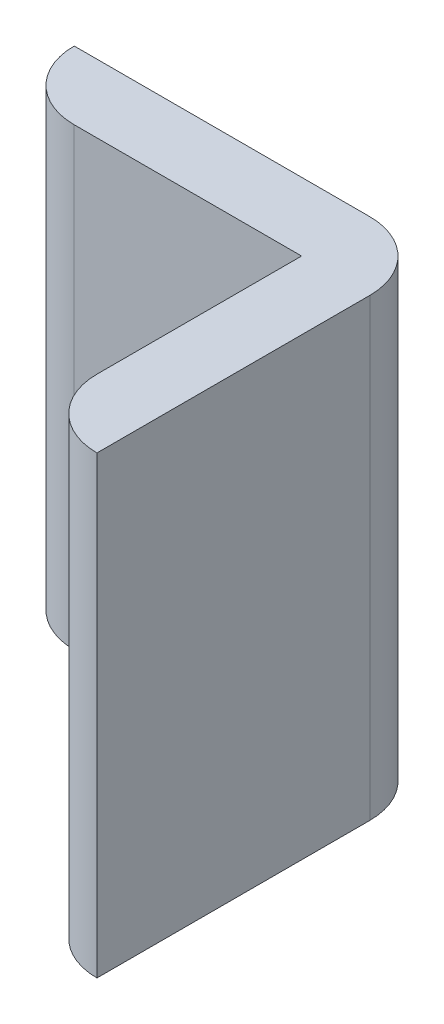
ISO-10303-21;
HEADER;
FILE_DESCRIPTION(('STEP AP214'),'2;1');
FILE_NAME('part.step','',(''),(''),'','','');
FILE_SCHEMA(('AUTOMOTIVE_DESIGN { 1 0 10303 214 1 1 1 1 }'));
ENDSEC;
DATA;
#1=APPLICATION_CONTEXT('core data for automotive mechanical design processes');
#2=APPLICATION_PROTOCOL_DEFINITION('international standard','automotive_design',2000,#1);
#3=PRODUCT_CONTEXT('',#1,'mechanical');
#4=PRODUCT('Part','Part','',(#3));
#5=PRODUCT_RELATED_PRODUCT_CATEGORY('part','',(#4));
#6=PRODUCT_DEFINITION_FORMATION('','',#4);
#7=PRODUCT_DEFINITION_CONTEXT('part definition',#1,'design');
#8=PRODUCT_DEFINITION('design','',#6,#7);
#9=PRODUCT_DEFINITION_SHAPE('','',#8);
#10=(LENGTH_UNIT() NAMED_UNIT(*) SI_UNIT(.MILLI.,.METRE.));
#11=(NAMED_UNIT(*) PLANE_ANGLE_UNIT() SI_UNIT($,.RADIAN.));
#12=(NAMED_UNIT(*) SI_UNIT($,.STERADIAN.) SOLID_ANGLE_UNIT());
#13=UNCERTAINTY_MEASURE_WITH_UNIT(LENGTH_MEASURE(1.E-05),#10,'distance_accuracy_value','');
#14=(GEOMETRIC_REPRESENTATION_CONTEXT(3) GLOBAL_UNCERTAINTY_ASSIGNED_CONTEXT((#13)) GLOBAL_UNIT_ASSIGNED_CONTEXT((#10,
#11,#12)) REPRESENTATION_CONTEXT('',''));
#15=CARTESIAN_POINT('',(0.,0.,0.));
#16=DIRECTION('',(0.,0.,1.));
#17=DIRECTION('',(1.,0.,0.));
#18=AXIS2_PLACEMENT_3D('',#15,#16,#17);
#19=CARTESIAN_POINT('',(1.3081,-2.159,0.381));
#20=DIRECTION('',(-1.,0.,0.));
#21=DIRECTION('',(0.,0.,1.));
#22=AXIS2_PLACEMENT_3D('',#19,#20,#21);
#23=PLANE('',#22);
#24=DIRECTION('',(0.,0.,-1.));
#25=VECTOR('',#24,1.);
#26=CARTESIAN_POINT('',(1.3081,-2.159,0.));
#27=LINE('',#26,#25);
#28=CARTESIAN_POINT('',(1.3081,-2.159,0.0762));
#29=VERTEX_POINT('',#28);
#30=CARTESIAN_POINT('',(1.3081,-2.159,0.381));
#31=VERTEX_POINT('',#30);
#32=EDGE_CURVE('E129',#29,#31,#27,.F.);
#33=ORIENTED_EDGE('',*,*,#32,.F.);
#34=DIRECTION('',(0.,-1.,0.));
#35=VECTOR('',#34,1.);
#36=CARTESIAN_POINT('',(1.3081,-2.159,0.0762));
#37=LINE('',#36,#35);
#38=CARTESIAN_POINT('',(1.3081,-1.651,0.0762));
#39=VERTEX_POINT('',#38);
#40=EDGE_CURVE('E82',#39,#29,#37,.T.);
#41=ORIENTED_EDGE('',*,*,#40,.F.);
#42=DIRECTION('',(0.,0.,-1.));
#43=VECTOR('',#42,1.);
#44=CARTESIAN_POINT('',(1.3081,-1.651,0.));
#45=LINE('',#44,#43);
#46=CARTESIAN_POINT('',(1.3081,-1.651,0.381));
#47=VERTEX_POINT('',#46);
#48=EDGE_CURVE('E77',#39,#47,#45,.F.);
#49=ORIENTED_EDGE('',*,*,#48,.T.);
#50=DIRECTION('',(0.,-1.,0.));
#51=VECTOR('',#50,1.);
#52=CARTESIAN_POINT('',(1.3081,-2.159,0.381));
#53=LINE('',#52,#51);
#54=EDGE_CURVE('E123',#31,#47,#53,.F.);
#55=ORIENTED_EDGE('',*,*,#54,.F.);
#56=EDGE_LOOP('',(#33,#41,#49,#55));
#57=FACE_BOUND('',#56,.T.);
#58=ADVANCED_FACE('F17',(#57),#23,.F.);
#59=CARTESIAN_POINT('',(1.3081,-2.159,0.3048));
#60=DIRECTION('',(0.,-1.,0.));
#61=DIRECTION('',(0.,0.,-1.));
#62=AXIS2_PLACEMENT_3D('',#59,#60,#61);
#63=CYLINDRICAL_SURFACE('',#62,0.0762);
#64=CARTESIAN_POINT('',(1.3081,-1.651,0.3048));
#65=DIRECTION('',(0.,-1.,0.));
#66=DIRECTION('',(0.,0.,-1.));
#67=AXIS2_PLACEMENT_3D('',#64,#65,#66);
#68=CIRCLE('',#67,0.0762);
#69=CARTESIAN_POINT('',(1.2319,-1.651,0.3048));
#70=VERTEX_POINT('',#69);
#71=EDGE_CURVE('E107',#47,#70,#68,.T.);
#72=ORIENTED_EDGE('',*,*,#71,.T.);
#73=DIRECTION('',(0.,1.,0.));
#74=VECTOR('',#73,1.);
#75=CARTESIAN_POINT('',(1.2319,-2.159,0.3048));
#76=LINE('',#75,#74);
#77=CARTESIAN_POINT('',(1.2319,-2.159,0.3048));
#78=VERTEX_POINT('',#77);
#79=EDGE_CURVE('E118',#70,#78,#76,.F.);
#80=ORIENTED_EDGE('',*,*,#79,.T.);
#81=CARTESIAN_POINT('',(1.3081,-2.159,0.3048));
#82=DIRECTION('',(0.,-1.,0.));
#83=DIRECTION('',(0.,0.,-1.));
#84=AXIS2_PLACEMENT_3D('',#81,#82,#83);
#85=CIRCLE('',#84,0.0762);
#86=EDGE_CURVE('E126',#31,#78,#85,.T.);
#87=ORIENTED_EDGE('',*,*,#86,.F.);
#88=ORIENTED_EDGE('',*,*,#54,.T.);
#89=EDGE_LOOP('',(#72,#80,#87,#88));
#90=FACE_BOUND('',#89,.T.);
#91=ADVANCED_FACE('F133',(#90),#63,.T.);
#92=CARTESIAN_POINT('',(1.2319,-2.159,0.0762));
#93=DIRECTION('',(1.,0.,0.));
#94=DIRECTION('',(0.,0.,-1.));
#95=AXIS2_PLACEMENT_3D('',#92,#93,#94);
#96=PLANE('',#95);
#97=ORIENTED_EDGE('',*,*,#79,.F.);
#98=DIRECTION('',(0.,0.,-1.));
#99=VECTOR('',#98,1.);
#100=CARTESIAN_POINT('',(1.2319,-1.651,0.));
#101=LINE('',#100,#99);
#102=CARTESIAN_POINT('',(1.2319,-1.651,0.0762));
#103=VERTEX_POINT('',#102);
#104=EDGE_CURVE('E102',#70,#103,#101,.T.);
#105=ORIENTED_EDGE('',*,*,#104,.T.);
#106=DIRECTION('',(0.,1.,0.));
#107=VECTOR('',#106,1.);
#108=CARTESIAN_POINT('',(1.2319,-2.159,0.0762));
#109=LINE('',#108,#107);
#110=CARTESIAN_POINT('',(1.2319,-2.159,0.0762));
#111=VERTEX_POINT('',#110);
#112=EDGE_CURVE('E115',#103,#111,#109,.F.);
#113=ORIENTED_EDGE('',*,*,#112,.T.);
#114=DIRECTION('',(0.,0.,-1.));
#115=VECTOR('',#114,1.);
#116=CARTESIAN_POINT('',(1.2319,-2.159,0.));
#117=LINE('',#116,#115);
#118=EDGE_CURVE('E128',#78,#111,#117,.T.);
#119=ORIENTED_EDGE('',*,*,#118,.F.);
#120=EDGE_LOOP('',(#97,#105,#113,#119));
#121=FACE_BOUND('',#120,.T.);
#122=ADVANCED_FACE('F158',(#121),#96,.F.);
#123=CARTESIAN_POINT('',(0.9779,-2.159,0.0762));
#124=DIRECTION('',(0.,0.,-1.));
#125=DIRECTION('',(-1.,0.,0.));
#126=AXIS2_PLACEMENT_3D('',#123,#124,#125);
#127=PLANE('',#126);
#128=ORIENTED_EDGE('',*,*,#112,.F.);
#129=DIRECTION('',(1.,0.,0.));
#130=VECTOR('',#129,1.);
#131=CARTESIAN_POINT('',(0.9017,-1.651,0.0762));
#132=LINE('',#131,#130);
#133=CARTESIAN_POINT('',(0.9779,-1.651,0.0762));
#134=VERTEX_POINT('',#133);
#135=EDGE_CURVE('E98',#103,#134,#132,.F.);
#136=ORIENTED_EDGE('',*,*,#135,.T.);
#137=DIRECTION('',(0.,-1.,0.));
#138=VECTOR('',#137,1.);
#139=CARTESIAN_POINT('',(0.9779,-2.159,0.0762));
#140=LINE('',#139,#138);
#141=CARTESIAN_POINT('',(0.9779,-2.159,0.0762));
#142=VERTEX_POINT('',#141);
#143=EDGE_CURVE('E101',#142,#134,#140,.F.);
#144=ORIENTED_EDGE('',*,*,#143,.F.);
#145=DIRECTION('',(1.,0.,0.));
#146=VECTOR('',#145,1.);
#147=CARTESIAN_POINT('',(0.9017,-2.159,0.0762));
#148=LINE('',#147,#146);
#149=EDGE_CURVE('E94',#111,#142,#148,.F.);
#150=ORIENTED_EDGE('',*,*,#149,.F.);
#151=EDGE_LOOP('',(#128,#136,#144,#150));
#152=FACE_BOUND('',#151,.T.);
#153=ADVANCED_FACE('F156',(#152),#127,.F.);
#154=CARTESIAN_POINT('',(1.2319,-2.159,0.0762));
#155=DIRECTION('',(0.,-1.,0.));
#156=DIRECTION('',(0.,0.,-1.));
#157=AXIS2_PLACEMENT_3D('',#154,#155,#156);
#158=CYLINDRICAL_SURFACE('',#157,0.0762);
#159=CARTESIAN_POINT('',(1.2319,-1.651,0.0762));
#160=DIRECTION('',(0.,-1.,0.));
#161=DIRECTION('',(0.,0.,-1.));
#162=AXIS2_PLACEMENT_3D('',#159,#160,#161);
#163=CIRCLE('',#162,0.0762);
#164=CARTESIAN_POINT('',(1.2319,-1.651,0.));
#165=VERTEX_POINT('',#164);
#166=EDGE_CURVE('E20',#165,#39,#163,.T.);
#167=ORIENTED_EDGE('',*,*,#166,.T.);
#168=ORIENTED_EDGE('',*,*,#40,.T.);
#169=CARTESIAN_POINT('',(1.2319,-2.159,0.0762));
#170=DIRECTION('',(0.,-1.,0.));
#171=DIRECTION('',(0.,0.,-1.));
#172=AXIS2_PLACEMENT_3D('',#169,#170,#171);
#173=CIRCLE('',#172,0.0762);
#174=CARTESIAN_POINT('',(1.2319,-2.159,0.));
#175=VERTEX_POINT('',#174);
#176=EDGE_CURVE('E92',#175,#29,#173,.T.);
#177=ORIENTED_EDGE('',*,*,#176,.F.);
#178=DIRECTION('',(0.,1.,0.));
#179=VECTOR('',#178,1.);
#180=CARTESIAN_POINT('',(1.2319,-2.159,0.));
#181=LINE('',#180,#179);
#182=EDGE_CURVE('E86',#175,#165,#181,.T.);
#183=ORIENTED_EDGE('',*,*,#182,.T.);
#184=EDGE_LOOP('',(#167,#168,#177,#183));
#185=FACE_BOUND('',#184,.T.);
#186=ADVANCED_FACE('F90',(#185),#158,.T.);
#187=CARTESIAN_POINT('',(0.9017,-1.651,0.));
#188=DIRECTION('',(0.,-1.,0.));
#189=DIRECTION('',(0.,0.,-1.));
#190=AXIS2_PLACEMENT_3D('',#187,#188,#189);
#191=PLANE('',#190);
#192=ORIENTED_EDGE('',*,*,#135,.F.);
#193=ORIENTED_EDGE('',*,*,#104,.F.);
#194=ORIENTED_EDGE('',*,*,#71,.F.);
#195=ORIENTED_EDGE('',*,*,#48,.F.);
#196=ORIENTED_EDGE('',*,*,#166,.F.);
#197=DIRECTION('',(1.,0.,0.));
#198=VECTOR('',#197,1.);
#199=CARTESIAN_POINT('',(1.2319,-1.651,0.));
#200=LINE('',#199,#198);
#201=CARTESIAN_POINT('',(0.9017,-1.651,0.));
#202=VERTEX_POINT('',#201);
#203=EDGE_CURVE('E74',#165,#202,#200,.F.);
#204=ORIENTED_EDGE('',*,*,#203,.T.);
#205=CARTESIAN_POINT('',(0.9779,-1.651,0.));
#206=DIRECTION('',(0.,-1.,0.));
#207=DIRECTION('',(0.,0.,-1.));
#208=AXIS2_PLACEMENT_3D('',#205,#206,#207);
#209=CIRCLE('',#208,0.0762);
#210=EDGE_CURVE('E114',#134,#202,#209,.T.);
#211=ORIENTED_EDGE('',*,*,#210,.F.);
#212=EDGE_LOOP('',(#192,#193,#194,#195,#196,#204,#211));
#213=FACE_BOUND('',#212,.T.);
#214=ADVANCED_FACE('F72',(#213),#191,.F.);
#215=CARTESIAN_POINT('',(0.9779,-2.159,0.));
#216=DIRECTION('',(0.,-1.,0.));
#217=DIRECTION('',(0.,0.,-1.));
#218=AXIS2_PLACEMENT_3D('',#215,#216,#217);
#219=CYLINDRICAL_SURFACE('',#218,0.0762);
#220=ORIENTED_EDGE('',*,*,#210,.T.);
#221=DIRECTION('',(0.,1.,0.));
#222=VECTOR('',#221,1.);
#223=CARTESIAN_POINT('',(0.9017,-2.159,0.));
#224=LINE('',#223,#222);
#225=CARTESIAN_POINT('',(0.9017,-2.159,0.));
#226=VERTEX_POINT('',#225);
#227=EDGE_CURVE('E26',#202,#226,#224,.F.);
#228=ORIENTED_EDGE('',*,*,#227,.T.);
#229=CARTESIAN_POINT('',(0.9779,-2.159,0.));
#230=DIRECTION('',(0.,-1.,0.));
#231=DIRECTION('',(0.,0.,-1.));
#232=AXIS2_PLACEMENT_3D('',#229,#230,#231);
#233=CIRCLE('',#232,0.0762);
#234=EDGE_CURVE('E34',#142,#226,#233,.T.);
#235=ORIENTED_EDGE('',*,*,#234,.F.);
#236=ORIENTED_EDGE('',*,*,#143,.T.);
#237=EDGE_LOOP('',(#220,#228,#235,#236));
#238=FACE_BOUND('',#237,.T.);
#239=ADVANCED_FACE('F141',(#238),#219,.T.);
#240=CARTESIAN_POINT('',(0.9017,-2.159,0.));
#241=DIRECTION('',(0.,-1.,0.));
#242=DIRECTION('',(0.,0.,-1.));
#243=AXIS2_PLACEMENT_3D('',#240,#241,#242);
#244=PLANE('',#243);
#245=ORIENTED_EDGE('',*,*,#149,.T.);
#246=ORIENTED_EDGE('',*,*,#234,.T.);
#247=DIRECTION('',(1.,0.,0.));
#248=VECTOR('',#247,1.);
#249=CARTESIAN_POINT('',(1.2319,-2.159,0.));
#250=LINE('',#249,#248);
#251=EDGE_CURVE('E11',#226,#175,#250,.T.);
#252=ORIENTED_EDGE('',*,*,#251,.T.);
#253=ORIENTED_EDGE('',*,*,#176,.T.);
#254=ORIENTED_EDGE('',*,*,#32,.T.);
#255=ORIENTED_EDGE('',*,*,#86,.T.);
#256=ORIENTED_EDGE('',*,*,#118,.T.);
#257=EDGE_LOOP('',(#245,#246,#252,#253,#254,#255,#256));
#258=FACE_BOUND('',#257,.T.);
#259=ADVANCED_FACE('F139',(#258),#244,.T.);
#260=CARTESIAN_POINT('',(1.2319,-2.159,0.));
#261=DIRECTION('',(0.,0.,1.));
#262=DIRECTION('',(1.,0.,0.));
#263=AXIS2_PLACEMENT_3D('',#260,#261,#262);
#264=PLANE('',#263);
#265=ORIENTED_EDGE('',*,*,#227,.F.);
#266=ORIENTED_EDGE('',*,*,#203,.F.);
#267=ORIENTED_EDGE('',*,*,#182,.F.);
#268=ORIENTED_EDGE('',*,*,#251,.F.);
#269=EDGE_LOOP('',(#265,#266,#267,#268));
#270=FACE_BOUND('',#269,.T.);
#271=ADVANCED_FACE('F85',(#270),#264,.F.);
#272=CLOSED_SHELL('',(#58,#91,#122,#153,#186,#214,#239,#259,#271));
#273=MANIFOLD_SOLID_BREP('B1',#272);
#274=ADVANCED_BREP_SHAPE_REPRESENTATION('',(#18,#273),#14);
#275=SHAPE_DEFINITION_REPRESENTATION(#9,#274);
ENDSEC;
END-ISO-10303-21;
